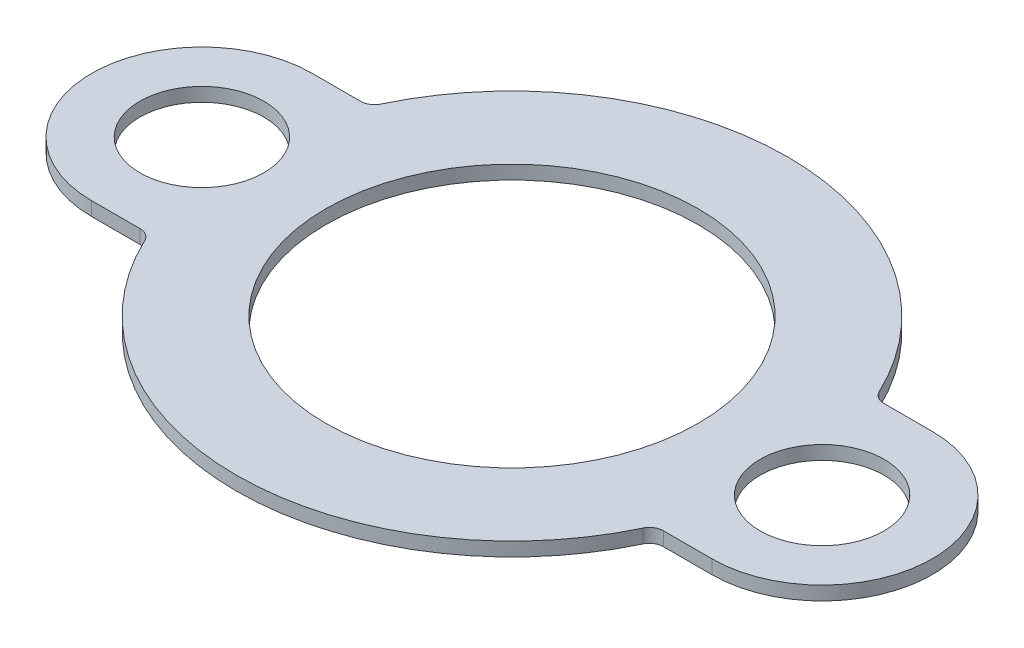
ISO-10303-21;
HEADER;
FILE_DESCRIPTION(('STEP AP214'),'2;1');
FILE_NAME('part.step','',(''),(''),'','','');
FILE_SCHEMA(('AUTOMOTIVE_DESIGN { 1 0 10303 214 1 1 1 1 }'));
ENDSEC;
DATA;
#1=APPLICATION_CONTEXT('core data for automotive mechanical design processes');
#2=APPLICATION_PROTOCOL_DEFINITION('international standard','automotive_design',2000,#1);
#3=PRODUCT_CONTEXT('',#1,'mechanical');
#4=PRODUCT('Part','Part','',(#3));
#5=PRODUCT_RELATED_PRODUCT_CATEGORY('part','',(#4));
#6=PRODUCT_DEFINITION_FORMATION('','',#4);
#7=PRODUCT_DEFINITION_CONTEXT('part definition',#1,'design');
#8=PRODUCT_DEFINITION('design','',#6,#7);
#9=PRODUCT_DEFINITION_SHAPE('','',#8);
#10=(LENGTH_UNIT() NAMED_UNIT(*) SI_UNIT(.MILLI.,.METRE.));
#11=(NAMED_UNIT(*) PLANE_ANGLE_UNIT() SI_UNIT($,.RADIAN.));
#12=(NAMED_UNIT(*) SI_UNIT($,.STERADIAN.) SOLID_ANGLE_UNIT());
#13=UNCERTAINTY_MEASURE_WITH_UNIT(LENGTH_MEASURE(1.E-05),#10,'distance_accuracy_value','');
#14=(GEOMETRIC_REPRESENTATION_CONTEXT(3) GLOBAL_UNCERTAINTY_ASSIGNED_CONTEXT((#13)) GLOBAL_UNIT_ASSIGNED_CONTEXT((#10,
#11,#12)) REPRESENTATION_CONTEXT('',''));
#15=CARTESIAN_POINT('',(0.,0.,0.));
#16=DIRECTION('',(0.,0.,1.));
#17=DIRECTION('',(1.,0.,0.));
#18=AXIS2_PLACEMENT_3D('',#15,#16,#17);
#19=CARTESIAN_POINT('',(18.9736659610103,1.,-9.));
#20=DIRECTION('',(0.,-1.,0.));
#21=DIRECTION('',(0.,0.,-1.));
#22=AXIS2_PLACEMENT_3D('',#19,#20,#21);
#23=PLANE('',#22);
#24=CARTESIAN_POINT('',(22.5,1.,0.));
#25=DIRECTION('',(0.,1.,0.));
#26=DIRECTION('',(0.,0.,1.));
#27=AXIS2_PLACEMENT_3D('',#24,#25,#26);
#28=CIRCLE('',#27,4.5);
#29=CARTESIAN_POINT('',(22.5,1.,4.5));
#30=VERTEX_POINT('',#29);
#31=EDGE_CURVE('E284',#30,#30,#28,.T.);
#32=ORIENTED_EDGE('',*,*,#31,.F.);
#33=EDGE_LOOP('',(#32));
#34=FACE_BOUND('',#33,.T.);
#35=CARTESIAN_POINT('',(18.9736659610103,1.,-9.));
#36=DIRECTION('',(0.,-1.,0.));
#37=DIRECTION('',(0.,0.,-1.));
#38=AXIS2_PLACEMENT_3D('',#35,#36,#37);
#39=CIRCLE('',#38,0.999999999999999);
#40=CARTESIAN_POINT('',(18.9736659610103,1.,-8.));
#41=VERTEX_POINT('',#40);
#42=CARTESIAN_POINT('',(18.070158058105,1.,-8.57142857142857));
#43=VERTEX_POINT('',#42);
#44=EDGE_CURVE('E174',#41,#43,#39,.T.);
#45=ORIENTED_EDGE('',*,*,#44,.T.);
#46=CARTESIAN_POINT('',(0.,1.,0.));
#47=DIRECTION('',(0.,1.,0.));
#48=DIRECTION('',(0.,0.,1.));
#49=AXIS2_PLACEMENT_3D('',#46,#47,#48);
#50=CIRCLE('',#49,20.);
#51=CARTESIAN_POINT('',(-18.070158058105,1.,-8.57142857142857));
#52=VERTEX_POINT('',#51);
#53=EDGE_CURVE('E102',#43,#52,#50,.T.);
#54=ORIENTED_EDGE('',*,*,#53,.T.);
#55=CARTESIAN_POINT('',(-18.9736659610103,1.,-9.));
#56=DIRECTION('',(0.,-1.,0.));
#57=DIRECTION('',(0.,0.,1.));
#58=AXIS2_PLACEMENT_3D('',#55,#56,#57);
#59=CIRCLE('',#58,1.);
#60=CARTESIAN_POINT('',(-18.9736659610103,1.,-8.));
#61=VERTEX_POINT('',#60);
#62=EDGE_CURVE('E201',#52,#61,#59,.T.);
#63=ORIENTED_EDGE('',*,*,#62,.T.);
#64=DIRECTION('',(-1.,0.,0.));
#65=VECTOR('',#64,1.);
#66=CARTESIAN_POINT('',(-18.9736659610103,1.,-8.));
#67=LINE('',#66,#65);
#68=CARTESIAN_POINT('',(-22.5,1.,-8.));
#69=VERTEX_POINT('',#68);
#70=EDGE_CURVE('E220',#61,#69,#67,.T.);
#71=ORIENTED_EDGE('',*,*,#70,.T.);
#72=CARTESIAN_POINT('',(-22.5,1.,0.));
#73=DIRECTION('',(0.,1.,0.));
#74=DIRECTION('',(0.,0.,1.));
#75=AXIS2_PLACEMENT_3D('',#72,#73,#74);
#76=CIRCLE('',#75,8.);
#77=CARTESIAN_POINT('',(-22.5,1.,8.));
#78=VERTEX_POINT('',#77);
#79=EDGE_CURVE('E217',#69,#78,#76,.T.);
#80=ORIENTED_EDGE('',*,*,#79,.T.);
#81=DIRECTION('',(1.,0.,0.));
#82=VECTOR('',#81,1.);
#83=CARTESIAN_POINT('',(-22.5,1.,8.));
#84=LINE('',#83,#82);
#85=CARTESIAN_POINT('',(-18.9736659610103,1.,8.));
#86=VERTEX_POINT('',#85);
#87=EDGE_CURVE('E219',#78,#86,#84,.T.);
#88=ORIENTED_EDGE('',*,*,#87,.T.);
#89=CARTESIAN_POINT('',(-18.9736659610103,1.,9.));
#90=DIRECTION('',(0.,-1.,0.));
#91=DIRECTION('',(0.,0.,-1.));
#92=AXIS2_PLACEMENT_3D('',#89,#90,#91);
#93=CIRCLE('',#92,1.);
#94=CARTESIAN_POINT('',(-18.070158058105,1.,8.57142857142856));
#95=VERTEX_POINT('',#94);
#96=EDGE_CURVE('E222',#86,#95,#93,.T.);
#97=ORIENTED_EDGE('',*,*,#96,.T.);
#98=CARTESIAN_POINT('',(0.,1.,0.));
#99=DIRECTION('',(0.,1.,0.));
#100=DIRECTION('',(0.,0.,1.));
#101=AXIS2_PLACEMENT_3D('',#98,#99,#100);
#102=CIRCLE('',#101,20.);
#103=CARTESIAN_POINT('',(18.070158058105,1.,8.57142857142857));
#104=VERTEX_POINT('',#103);
#105=EDGE_CURVE('E228',#95,#104,#102,.T.);
#106=ORIENTED_EDGE('',*,*,#105,.T.);
#107=CARTESIAN_POINT('',(18.9736659610103,1.,9.));
#108=DIRECTION('',(0.,-1.,0.));
#109=DIRECTION('',(0.,0.,1.));
#110=AXIS2_PLACEMENT_3D('',#107,#108,#109);
#111=CIRCLE('',#110,1.);
#112=CARTESIAN_POINT('',(18.9736659610103,1.,8.));
#113=VERTEX_POINT('',#112);
#114=EDGE_CURVE('E133',#104,#113,#111,.T.);
#115=ORIENTED_EDGE('',*,*,#114,.T.);
#116=DIRECTION('',(1.,0.,0.));
#117=VECTOR('',#116,1.);
#118=CARTESIAN_POINT('',(22.5,1.,8.));
#119=LINE('',#118,#117);
#120=CARTESIAN_POINT('',(22.5,1.,8.));
#121=VERTEX_POINT('',#120);
#122=EDGE_CURVE('E127',#113,#121,#119,.T.);
#123=ORIENTED_EDGE('',*,*,#122,.T.);
#124=CARTESIAN_POINT('',(22.5,1.,0.));
#125=DIRECTION('',(0.,1.,0.));
#126=DIRECTION('',(0.,0.,-1.));
#127=AXIS2_PLACEMENT_3D('',#124,#125,#126);
#128=CIRCLE('',#127,8.);
#129=CARTESIAN_POINT('',(22.5,1.,-8.));
#130=VERTEX_POINT('',#129);
#131=EDGE_CURVE('E131',#121,#130,#128,.T.);
#132=ORIENTED_EDGE('',*,*,#131,.T.);
#133=DIRECTION('',(-1.,0.,0.));
#134=VECTOR('',#133,1.);
#135=CARTESIAN_POINT('',(18.9736659610103,1.,-8.));
#136=LINE('',#135,#134);
#137=EDGE_CURVE('E47',#130,#41,#136,.T.);
#138=ORIENTED_EDGE('',*,*,#137,.T.);
#139=EDGE_LOOP('',(#45,#54,#63,#71,#80,#88,#97,#106,#115,#123,#132,#138));
#140=FACE_BOUND('',#139,.T.);
#141=CARTESIAN_POINT('',(0.,1.,0.));
#142=DIRECTION('',(0.,1.,0.));
#143=DIRECTION('',(0.,0.,1.));
#144=AXIS2_PLACEMENT_3D('',#141,#142,#143);
#145=CIRCLE('',#144,13.5);
#146=CARTESIAN_POINT('',(0.,1.,13.5));
#147=VERTEX_POINT('',#146);
#148=EDGE_CURVE('E155',#147,#147,#145,.T.);
#149=ORIENTED_EDGE('',*,*,#148,.F.);
#150=EDGE_LOOP('',(#149));
#151=FACE_BOUND('',#150,.T.);
#152=CARTESIAN_POINT('',(-22.5,1.,0.));
#153=DIRECTION('',(0.,1.,0.));
#154=DIRECTION('',(0.,0.,-1.));
#155=AXIS2_PLACEMENT_3D('',#152,#153,#154);
#156=CIRCLE('',#155,4.5);
#157=CARTESIAN_POINT('',(-22.5,1.,-4.5));
#158=VERTEX_POINT('',#157);
#159=EDGE_CURVE('E275',#158,#158,#156,.T.);
#160=ORIENTED_EDGE('',*,*,#159,.F.);
#161=EDGE_LOOP('',(#160));
#162=FACE_BOUND('',#161,.T.);
#163=ADVANCED_FACE('F30',(#34,#140,#151,#162),#23,.F.);
#164=CARTESIAN_POINT('',(18.9736659610103,0.,-9.));
#165=DIRECTION('',(0.,-1.,0.));
#166=DIRECTION('',(0.,0.,-1.));
#167=AXIS2_PLACEMENT_3D('',#164,#165,#166);
#168=PLANE('',#167);
#169=CARTESIAN_POINT('',(22.5,0.,0.));
#170=DIRECTION('',(0.,1.,0.));
#171=DIRECTION('',(0.,0.,1.));
#172=AXIS2_PLACEMENT_3D('',#169,#170,#171);
#173=CIRCLE('',#172,4.5);
#174=CARTESIAN_POINT('',(22.5,0.,4.5));
#175=VERTEX_POINT('',#174);
#176=EDGE_CURVE('E281',#175,#175,#173,.T.);
#177=ORIENTED_EDGE('',*,*,#176,.T.);
#178=EDGE_LOOP('',(#177));
#179=FACE_BOUND('',#178,.T.);
#180=CARTESIAN_POINT('',(18.9736659610103,0.,-9.));
#181=DIRECTION('',(0.,-1.,0.));
#182=DIRECTION('',(0.,0.,-1.));
#183=AXIS2_PLACEMENT_3D('',#180,#181,#182);
#184=CIRCLE('',#183,0.999999999999999);
#185=CARTESIAN_POINT('',(18.9736659610103,0.,-8.));
#186=VERTEX_POINT('',#185);
#187=CARTESIAN_POINT('',(18.070158058105,0.,-8.57142857142857));
#188=VERTEX_POINT('',#187);
#189=EDGE_CURVE('E151',#186,#188,#184,.T.);
#190=ORIENTED_EDGE('',*,*,#189,.F.);
#191=DIRECTION('',(-1.,0.,0.));
#192=VECTOR('',#191,1.);
#193=CARTESIAN_POINT('',(18.9736659610103,0.,-8.));
#194=LINE('',#193,#192);
#195=CARTESIAN_POINT('',(22.5,0.,-8.));
#196=VERTEX_POINT('',#195);
#197=EDGE_CURVE('E94',#196,#186,#194,.T.);
#198=ORIENTED_EDGE('',*,*,#197,.F.);
#199=CARTESIAN_POINT('',(22.5,0.,0.));
#200=DIRECTION('',(0.,1.,0.));
#201=DIRECTION('',(0.,0.,-1.));
#202=AXIS2_PLACEMENT_3D('',#199,#200,#201);
#203=CIRCLE('',#202,8.);
#204=CARTESIAN_POINT('',(22.5,0.,8.));
#205=VERTEX_POINT('',#204);
#206=EDGE_CURVE('E88',#205,#196,#203,.T.);
#207=ORIENTED_EDGE('',*,*,#206,.F.);
#208=DIRECTION('',(1.,0.,0.));
#209=VECTOR('',#208,1.);
#210=CARTESIAN_POINT('',(22.5,0.,8.));
#211=LINE('',#210,#209);
#212=CARTESIAN_POINT('',(18.9736659610103,0.,8.));
#213=VERTEX_POINT('',#212);
#214=EDGE_CURVE('E141',#213,#205,#211,.T.);
#215=ORIENTED_EDGE('',*,*,#214,.F.);
#216=CARTESIAN_POINT('',(18.9736659610103,0.,9.));
#217=DIRECTION('',(0.,-1.,0.));
#218=DIRECTION('',(0.,0.,1.));
#219=AXIS2_PLACEMENT_3D('',#216,#217,#218);
#220=CIRCLE('',#219,1.);
#221=CARTESIAN_POINT('',(18.070158058105,0.,8.57142857142857));
#222=VERTEX_POINT('',#221);
#223=EDGE_CURVE('E169',#222,#213,#220,.T.);
#224=ORIENTED_EDGE('',*,*,#223,.F.);
#225=CARTESIAN_POINT('',(0.,0.,0.));
#226=DIRECTION('',(0.,1.,0.));
#227=DIRECTION('',(0.,0.,1.));
#228=AXIS2_PLACEMENT_3D('',#225,#226,#227);
#229=CIRCLE('',#228,20.);
#230=CARTESIAN_POINT('',(-18.070158058105,0.,8.57142857142856));
#231=VERTEX_POINT('',#230);
#232=EDGE_CURVE('E167',#231,#222,#229,.T.);
#233=ORIENTED_EDGE('',*,*,#232,.F.);
#234=CARTESIAN_POINT('',(-18.9736659610103,0.,9.));
#235=DIRECTION('',(0.,-1.,0.));
#236=DIRECTION('',(0.,0.,-1.));
#237=AXIS2_PLACEMENT_3D('',#234,#235,#236);
#238=CIRCLE('',#237,1.);
#239=CARTESIAN_POINT('',(-18.9736659610103,0.,8.));
#240=VERTEX_POINT('',#239);
#241=EDGE_CURVE('E165',#240,#231,#238,.T.);
#242=ORIENTED_EDGE('',*,*,#241,.F.);
#243=DIRECTION('',(1.,0.,0.));
#244=VECTOR('',#243,1.);
#245=CARTESIAN_POINT('',(-22.5,0.,8.));
#246=LINE('',#245,#244);
#247=CARTESIAN_POINT('',(-22.5,0.,8.));
#248=VERTEX_POINT('',#247);
#249=EDGE_CURVE('E163',#248,#240,#246,.T.);
#250=ORIENTED_EDGE('',*,*,#249,.F.);
#251=CARTESIAN_POINT('',(-22.5,0.,0.));
#252=DIRECTION('',(0.,1.,0.));
#253=DIRECTION('',(0.,0.,1.));
#254=AXIS2_PLACEMENT_3D('',#251,#252,#253);
#255=CIRCLE('',#254,8.);
#256=CARTESIAN_POINT('',(-22.5,0.,-8.));
#257=VERTEX_POINT('',#256);
#258=EDGE_CURVE('E161',#257,#248,#255,.T.);
#259=ORIENTED_EDGE('',*,*,#258,.F.);
#260=DIRECTION('',(-1.,0.,0.));
#261=VECTOR('',#260,1.);
#262=CARTESIAN_POINT('',(-18.9736659610103,0.,-8.));
#263=LINE('',#262,#261);
#264=CARTESIAN_POINT('',(-18.9736659610103,0.,-8.));
#265=VERTEX_POINT('',#264);
#266=EDGE_CURVE('E159',#265,#257,#263,.T.);
#267=ORIENTED_EDGE('',*,*,#266,.F.);
#268=CARTESIAN_POINT('',(-18.9736659610103,0.,-9.));
#269=DIRECTION('',(0.,-1.,0.));
#270=DIRECTION('',(0.,0.,1.));
#271=AXIS2_PLACEMENT_3D('',#268,#269,#270);
#272=CIRCLE('',#271,1.);
#273=CARTESIAN_POINT('',(-18.070158058105,0.,-8.57142857142857));
#274=VERTEX_POINT('',#273);
#275=EDGE_CURVE('E157',#274,#265,#272,.T.);
#276=ORIENTED_EDGE('',*,*,#275,.F.);
#277=CARTESIAN_POINT('',(0.,0.,0.));
#278=DIRECTION('',(0.,1.,0.));
#279=DIRECTION('',(0.,0.,1.));
#280=AXIS2_PLACEMENT_3D('',#277,#278,#279);
#281=CIRCLE('',#280,20.);
#282=EDGE_CURVE('E154',#188,#274,#281,.T.);
#283=ORIENTED_EDGE('',*,*,#282,.F.);
#284=EDGE_LOOP('',(#190,#198,#207,#215,#224,#233,#242,#250,#259,#267,#276,#283));
#285=FACE_BOUND('',#284,.T.);
#286=CARTESIAN_POINT('',(0.,0.,0.));
#287=DIRECTION('',(0.,1.,0.));
#288=DIRECTION('',(0.,0.,1.));
#289=AXIS2_PLACEMENT_3D('',#286,#287,#288);
#290=CIRCLE('',#289,13.5);
#291=CARTESIAN_POINT('',(0.,0.,13.5));
#292=VERTEX_POINT('',#291);
#293=EDGE_CURVE('E287',#292,#292,#290,.T.);
#294=ORIENTED_EDGE('',*,*,#293,.T.);
#295=EDGE_LOOP('',(#294));
#296=FACE_BOUND('',#295,.T.);
#297=CARTESIAN_POINT('',(-22.5,0.,0.));
#298=DIRECTION('',(0.,1.,0.));
#299=DIRECTION('',(0.,0.,-1.));
#300=AXIS2_PLACEMENT_3D('',#297,#298,#299);
#301=CIRCLE('',#300,4.5);
#302=CARTESIAN_POINT('',(-22.5,0.,-4.5));
#303=VERTEX_POINT('',#302);
#304=EDGE_CURVE('E278',#303,#303,#301,.T.);
#305=ORIENTED_EDGE('',*,*,#304,.T.);
#306=EDGE_LOOP('',(#305));
#307=FACE_BOUND('',#306,.T.);
#308=ADVANCED_FACE('F205',(#179,#285,#296,#307),#168,.T.);
#309=CARTESIAN_POINT('',(18.9736659610103,1.,-9.));
#310=DIRECTION('',(0.,-1.,0.));
#311=DIRECTION('',(0.,0.,-1.));
#312=AXIS2_PLACEMENT_3D('',#309,#310,#311);
#313=CYLINDRICAL_SURFACE('',#312,0.999999999999999);
#314=ORIENTED_EDGE('',*,*,#189,.T.);
#315=DIRECTION('',(0.,-1.,0.));
#316=VECTOR('',#315,1.);
#317=CARTESIAN_POINT('',(18.070158058105,1.,-8.57142857142857));
#318=LINE('',#317,#316);
#319=EDGE_CURVE('E11',#43,#188,#318,.T.);
#320=ORIENTED_EDGE('',*,*,#319,.F.);
#321=ORIENTED_EDGE('',*,*,#44,.F.);
#322=DIRECTION('',(0.,-1.,0.));
#323=VECTOR('',#322,1.);
#324=CARTESIAN_POINT('',(18.9736659610103,1.,-8.));
#325=LINE('',#324,#323);
#326=EDGE_CURVE('E147',#41,#186,#325,.T.);
#327=ORIENTED_EDGE('',*,*,#326,.T.);
#328=EDGE_LOOP('',(#314,#320,#321,#327));
#329=FACE_BOUND('',#328,.T.);
#330=ADVANCED_FACE('F32',(#329),#313,.F.);
#331=CARTESIAN_POINT('',(0.,1.,0.));
#332=DIRECTION('',(0.,-1.,0.));
#333=DIRECTION('',(0.,0.,-1.));
#334=AXIS2_PLACEMENT_3D('',#331,#332,#333);
#335=CYLINDRICAL_SURFACE('',#334,20.);
#336=ORIENTED_EDGE('',*,*,#282,.T.);
#337=DIRECTION('',(0.,-1.,0.));
#338=VECTOR('',#337,1.);
#339=CARTESIAN_POINT('',(-18.070158058105,1.,-8.57142857142857));
#340=LINE('',#339,#338);
#341=EDGE_CURVE('E39',#52,#274,#340,.T.);
#342=ORIENTED_EDGE('',*,*,#341,.F.);
#343=ORIENTED_EDGE('',*,*,#53,.F.);
#344=ORIENTED_EDGE('',*,*,#319,.T.);
#345=EDGE_LOOP('',(#336,#342,#343,#344));
#346=FACE_BOUND('',#345,.T.);
#347=ADVANCED_FACE('F388',(#346),#335,.T.);
#348=CARTESIAN_POINT('',(-18.9736659610103,1.,-9.));
#349=DIRECTION('',(0.,-1.,0.));
#350=DIRECTION('',(0.,0.,-1.));
#351=AXIS2_PLACEMENT_3D('',#348,#349,#350);
#352=CYLINDRICAL_SURFACE('',#351,1.);
#353=ORIENTED_EDGE('',*,*,#275,.T.);
#354=DIRECTION('',(0.,-1.,0.));
#355=VECTOR('',#354,1.);
#356=CARTESIAN_POINT('',(-18.9736659610103,1.,-8.));
#357=LINE('',#356,#355);
#358=EDGE_CURVE('E193',#61,#265,#357,.T.);
#359=ORIENTED_EDGE('',*,*,#358,.F.);
#360=ORIENTED_EDGE('',*,*,#62,.F.);
#361=ORIENTED_EDGE('',*,*,#341,.T.);
#362=EDGE_LOOP('',(#353,#359,#360,#361));
#363=FACE_BOUND('',#362,.T.);
#364=ADVANCED_FACE('F199',(#363),#352,.F.);
#365=CARTESIAN_POINT('',(-18.9736659610103,1.,-8.));
#366=DIRECTION('',(0.,0.,1.));
#367=DIRECTION('',(1.,0.,0.));
#368=AXIS2_PLACEMENT_3D('',#365,#366,#367);
#369=PLANE('',#368);
#370=ORIENTED_EDGE('',*,*,#266,.T.);
#371=DIRECTION('',(0.,-1.,0.));
#372=VECTOR('',#371,1.);
#373=CARTESIAN_POINT('',(-22.5,1.,-8.));
#374=LINE('',#373,#372);
#375=EDGE_CURVE('E190',#69,#257,#374,.T.);
#376=ORIENTED_EDGE('',*,*,#375,.F.);
#377=ORIENTED_EDGE('',*,*,#70,.F.);
#378=ORIENTED_EDGE('',*,*,#358,.T.);
#379=EDGE_LOOP('',(#370,#376,#377,#378));
#380=FACE_BOUND('',#379,.T.);
#381=ADVANCED_FACE('F211',(#380),#369,.F.);
#382=CARTESIAN_POINT('',(-22.5,1.,0.));
#383=DIRECTION('',(0.,-1.,0.));
#384=DIRECTION('',(0.,0.,-1.));
#385=AXIS2_PLACEMENT_3D('',#382,#383,#384);
#386=CYLINDRICAL_SURFACE('',#385,8.);
#387=ORIENTED_EDGE('',*,*,#258,.T.);
#388=DIRECTION('',(0.,-1.,0.));
#389=VECTOR('',#388,1.);
#390=CARTESIAN_POINT('',(-22.5,1.,8.));
#391=LINE('',#390,#389);
#392=EDGE_CURVE('E187',#78,#248,#391,.T.);
#393=ORIENTED_EDGE('',*,*,#392,.F.);
#394=ORIENTED_EDGE('',*,*,#79,.F.);
#395=ORIENTED_EDGE('',*,*,#375,.T.);
#396=EDGE_LOOP('',(#387,#393,#394,#395));
#397=FACE_BOUND('',#396,.T.);
#398=ADVANCED_FACE('F215',(#397),#386,.T.);
#399=CARTESIAN_POINT('',(-22.5,1.,8.));
#400=DIRECTION('',(0.,0.,-1.));
#401=DIRECTION('',(-1.,0.,0.));
#402=AXIS2_PLACEMENT_3D('',#399,#400,#401);
#403=PLANE('',#402);
#404=ORIENTED_EDGE('',*,*,#249,.T.);
#405=DIRECTION('',(0.,-1.,0.));
#406=VECTOR('',#405,1.);
#407=CARTESIAN_POINT('',(-18.9736659610103,1.,8.));
#408=LINE('',#407,#406);
#409=EDGE_CURVE('E184',#86,#240,#408,.T.);
#410=ORIENTED_EDGE('',*,*,#409,.F.);
#411=ORIENTED_EDGE('',*,*,#87,.F.);
#412=ORIENTED_EDGE('',*,*,#392,.T.);
#413=EDGE_LOOP('',(#404,#410,#411,#412));
#414=FACE_BOUND('',#413,.T.);
#415=ADVANCED_FACE('F353',(#414),#403,.F.);
#416=CARTESIAN_POINT('',(-18.9736659610103,1.,9.));
#417=DIRECTION('',(0.,-1.,0.));
#418=DIRECTION('',(0.,0.,-1.));
#419=AXIS2_PLACEMENT_3D('',#416,#417,#418);
#420=CYLINDRICAL_SURFACE('',#419,1.);
#421=ORIENTED_EDGE('',*,*,#241,.T.);
#422=DIRECTION('',(0.,-1.,0.));
#423=VECTOR('',#422,1.);
#424=CARTESIAN_POINT('',(-18.070158058105,1.,8.57142857142856));
#425=LINE('',#424,#423);
#426=EDGE_CURVE('E181',#95,#231,#425,.T.);
#427=ORIENTED_EDGE('',*,*,#426,.F.);
#428=ORIENTED_EDGE('',*,*,#96,.F.);
#429=ORIENTED_EDGE('',*,*,#409,.T.);
#430=EDGE_LOOP('',(#421,#427,#428,#429));
#431=FACE_BOUND('',#430,.T.);
#432=ADVANCED_FACE('F344',(#431),#420,.F.);
#433=CARTESIAN_POINT('',(0.,1.,0.));
#434=DIRECTION('',(0.,-1.,0.));
#435=DIRECTION('',(0.,0.,-1.));
#436=AXIS2_PLACEMENT_3D('',#433,#434,#435);
#437=CYLINDRICAL_SURFACE('',#436,20.);
#438=ORIENTED_EDGE('',*,*,#232,.T.);
#439=DIRECTION('',(0.,-1.,0.));
#440=VECTOR('',#439,1.);
#441=CARTESIAN_POINT('',(18.070158058105,1.,8.57142857142857));
#442=LINE('',#441,#440);
#443=EDGE_CURVE('E178',#104,#222,#442,.T.);
#444=ORIENTED_EDGE('',*,*,#443,.F.);
#445=ORIENTED_EDGE('',*,*,#105,.F.);
#446=ORIENTED_EDGE('',*,*,#426,.T.);
#447=EDGE_LOOP('',(#438,#444,#445,#446));
#448=FACE_BOUND('',#447,.T.);
#449=ADVANCED_FACE('F234',(#448),#437,.T.);
#450=CARTESIAN_POINT('',(18.9736659610103,1.,9.));
#451=DIRECTION('',(0.,-1.,0.));
#452=DIRECTION('',(0.,0.,-1.));
#453=AXIS2_PLACEMENT_3D('',#450,#451,#452);
#454=CYLINDRICAL_SURFACE('',#453,1.);
#455=ORIENTED_EDGE('',*,*,#223,.T.);
#456=DIRECTION('',(0.,-1.,0.));
#457=VECTOR('',#456,1.);
#458=CARTESIAN_POINT('',(18.9736659610103,1.,8.));
#459=LINE('',#458,#457);
#460=EDGE_CURVE('E142',#113,#213,#459,.T.);
#461=ORIENTED_EDGE('',*,*,#460,.F.);
#462=ORIENTED_EDGE('',*,*,#114,.F.);
#463=ORIENTED_EDGE('',*,*,#443,.T.);
#464=EDGE_LOOP('',(#455,#461,#462,#463));
#465=FACE_BOUND('',#464,.T.);
#466=ADVANCED_FACE('F238',(#465),#454,.F.);
#467=CARTESIAN_POINT('',(22.5,1.,8.));
#468=DIRECTION('',(0.,0.,-1.));
#469=DIRECTION('',(-1.,0.,0.));
#470=AXIS2_PLACEMENT_3D('',#467,#468,#469);
#471=PLANE('',#470);
#472=ORIENTED_EDGE('',*,*,#214,.T.);
#473=DIRECTION('',(0.,-1.,0.));
#474=VECTOR('',#473,1.);
#475=CARTESIAN_POINT('',(22.5,1.,8.));
#476=LINE('',#475,#474);
#477=EDGE_CURVE('E138',#121,#205,#476,.T.);
#478=ORIENTED_EDGE('',*,*,#477,.F.);
#479=ORIENTED_EDGE('',*,*,#122,.F.);
#480=ORIENTED_EDGE('',*,*,#460,.T.);
#481=EDGE_LOOP('',(#472,#478,#479,#480));
#482=FACE_BOUND('',#481,.T.);
#483=ADVANCED_FACE('F139',(#482),#471,.F.);
#484=CARTESIAN_POINT('',(22.5,1.,0.));
#485=DIRECTION('',(0.,-1.,0.));
#486=DIRECTION('',(0.,0.,-1.));
#487=AXIS2_PLACEMENT_3D('',#484,#485,#486);
#488=CYLINDRICAL_SURFACE('',#487,8.);
#489=ORIENTED_EDGE('',*,*,#206,.T.);
#490=DIRECTION('',(0.,-1.,0.));
#491=VECTOR('',#490,1.);
#492=CARTESIAN_POINT('',(22.5,1.,-8.));
#493=LINE('',#492,#491);
#494=EDGE_CURVE('E143',#130,#196,#493,.T.);
#495=ORIENTED_EDGE('',*,*,#494,.F.);
#496=ORIENTED_EDGE('',*,*,#131,.F.);
#497=ORIENTED_EDGE('',*,*,#477,.T.);
#498=EDGE_LOOP('',(#489,#495,#496,#497));
#499=FACE_BOUND('',#498,.T.);
#500=ADVANCED_FACE('F145',(#499),#488,.T.);
#501=CARTESIAN_POINT('',(18.9736659610103,1.,-8.));
#502=DIRECTION('',(0.,0.,1.));
#503=DIRECTION('',(1.,0.,0.));
#504=AXIS2_PLACEMENT_3D('',#501,#502,#503);
#505=PLANE('',#504);
#506=ORIENTED_EDGE('',*,*,#197,.T.);
#507=ORIENTED_EDGE('',*,*,#326,.F.);
#508=ORIENTED_EDGE('',*,*,#137,.F.);
#509=ORIENTED_EDGE('',*,*,#494,.T.);
#510=EDGE_LOOP('',(#506,#507,#508,#509));
#511=FACE_BOUND('',#510,.T.);
#512=ADVANCED_FACE('F242',(#511),#505,.F.);
#513=CARTESIAN_POINT('',(0.,1.,0.));
#514=DIRECTION('',(0.,-1.,0.));
#515=DIRECTION('',(0.,0.,-1.));
#516=AXIS2_PLACEMENT_3D('',#513,#514,#515);
#517=CYLINDRICAL_SURFACE('',#516,13.5);
#518=ORIENTED_EDGE('',*,*,#148,.T.);
#519=EDGE_LOOP('',(#518));
#520=FACE_BOUND('',#519,.T.);
#521=ORIENTED_EDGE('',*,*,#293,.F.);
#522=EDGE_LOOP('',(#521));
#523=FACE_BOUND('',#522,.T.);
#524=ADVANCED_FACE('F244',(#520,#523),#517,.F.);
#525=CARTESIAN_POINT('',(22.5,1.,0.));
#526=DIRECTION('',(0.,-1.,0.));
#527=DIRECTION('',(0.,0.,-1.));
#528=AXIS2_PLACEMENT_3D('',#525,#526,#527);
#529=CYLINDRICAL_SURFACE('',#528,4.5);
#530=ORIENTED_EDGE('',*,*,#31,.T.);
#531=EDGE_LOOP('',(#530));
#532=FACE_BOUND('',#531,.T.);
#533=ORIENTED_EDGE('',*,*,#176,.F.);
#534=EDGE_LOOP('',(#533));
#535=FACE_BOUND('',#534,.T.);
#536=ADVANCED_FACE('F250',(#532,#535),#529,.F.);
#537=CARTESIAN_POINT('',(-22.5,1.,0.));
#538=DIRECTION('',(0.,-1.,0.));
#539=DIRECTION('',(0.,0.,-1.));
#540=AXIS2_PLACEMENT_3D('',#537,#538,#539);
#541=CYLINDRICAL_SURFACE('',#540,4.5);
#542=ORIENTED_EDGE('',*,*,#159,.T.);
#543=EDGE_LOOP('',(#542));
#544=FACE_BOUND('',#543,.T.);
#545=ORIENTED_EDGE('',*,*,#304,.F.);
#546=EDGE_LOOP('',(#545));
#547=FACE_BOUND('',#546,.T.);
#548=ADVANCED_FACE('F266',(#544,#547),#541,.F.);
#549=CLOSED_SHELL('',(#163,#308,#330,#347,#364,#381,#398,#415,#432,#449,#466,#483,#500,#512,
#524,#536,#548));
#550=MANIFOLD_SOLID_BREP('B2',#549);
#551=ADVANCED_BREP_SHAPE_REPRESENTATION('',(#18,#550),#14);
#552=SHAPE_DEFINITION_REPRESENTATION(#9,#551);
ENDSEC;
END-ISO-10303-21;
